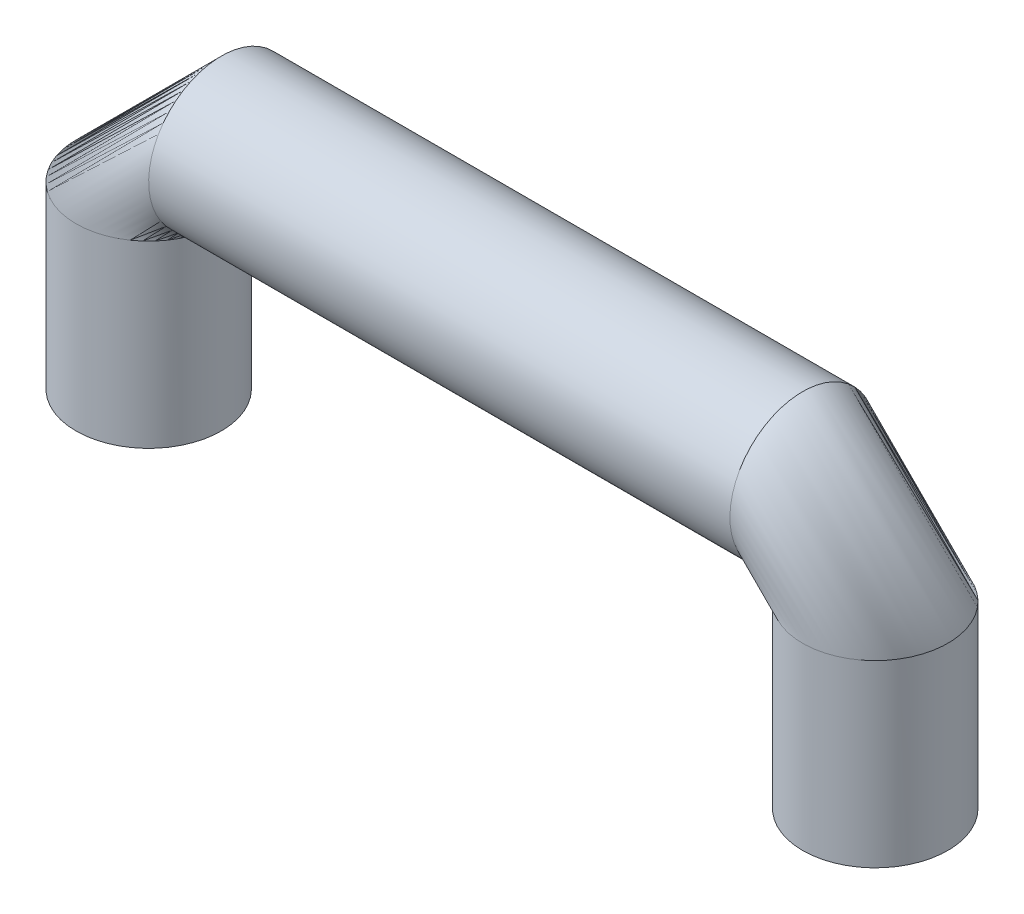
ISO-10303-21;
HEADER;
FILE_DESCRIPTION(('STEP AP214'),'2;1');
FILE_NAME('part.step','',(''),(''),'','','');
FILE_SCHEMA(('AUTOMOTIVE_DESIGN { 1 0 10303 214 1 1 1 1 }'));
ENDSEC;
DATA;
#1=APPLICATION_CONTEXT('core data for automotive mechanical design processes');
#2=APPLICATION_PROTOCOL_DEFINITION('international standard','automotive_design',2000,#1);
#3=PRODUCT_CONTEXT('',#1,'mechanical');
#4=PRODUCT('Part','Part','',(#3));
#5=PRODUCT_RELATED_PRODUCT_CATEGORY('part','',(#4));
#6=PRODUCT_DEFINITION_FORMATION('','',#4);
#7=PRODUCT_DEFINITION_CONTEXT('part definition',#1,'design');
#8=PRODUCT_DEFINITION('design','',#6,#7);
#9=PRODUCT_DEFINITION_SHAPE('','',#8);
#10=(LENGTH_UNIT() NAMED_UNIT(*) SI_UNIT(.MILLI.,.METRE.));
#11=(NAMED_UNIT(*) PLANE_ANGLE_UNIT() SI_UNIT($,.RADIAN.));
#12=(NAMED_UNIT(*) SI_UNIT($,.STERADIAN.) SOLID_ANGLE_UNIT());
#13=UNCERTAINTY_MEASURE_WITH_UNIT(LENGTH_MEASURE(1.E-05),#10,'distance_accuracy_value','');
#14=(GEOMETRIC_REPRESENTATION_CONTEXT(3) GLOBAL_UNCERTAINTY_ASSIGNED_CONTEXT((#13)) GLOBAL_UNIT_ASSIGNED_CONTEXT((#10,
#11,#12)) REPRESENTATION_CONTEXT('',''));
#15=CARTESIAN_POINT('',(0.,0.,0.));
#16=DIRECTION('',(0.,0.,1.));
#17=DIRECTION('',(1.,0.,0.));
#18=AXIS2_PLACEMENT_3D('',#15,#16,#17);
#19=CARTESIAN_POINT('',(0.,0.,0.));
#20=DIRECTION('',(0.,-1.,0.));
#21=DIRECTION('',(0.,0.,1.));
#22=AXIS2_PLACEMENT_3D('',#19,#20,#21);
#23=PLANE('',#22);
#24=CARTESIAN_POINT('',(0.,0.,0.));
#25=DIRECTION('',(0.,-1.,0.));
#26=DIRECTION('',(0.,0.,1.));
#27=AXIS2_PLACEMENT_3D('',#24,#25,#26);
#28=CIRCLE('',#27,25.4);
#29=CARTESIAN_POINT('',(0.,0.,25.4));
#30=VERTEX_POINT('',#29);
#31=EDGE_CURVE('E59',#30,#30,#28,.T.);
#32=ORIENTED_EDGE('',*,*,#31,.T.);
#33=EDGE_LOOP('',(#32));
#34=FACE_BOUND('',#33,.T.);
#35=ADVANCED_FACE('F47',(#34),#23,.T.);
#36=CARTESIAN_POINT('',(254.,0.,0.));
#37=DIRECTION('',(0.,1.,0.));
#38=DIRECTION('',(0.,0.,1.));
#39=AXIS2_PLACEMENT_3D('',#36,#37,#38);
#40=PLANE('',#39);
#41=CARTESIAN_POINT('',(254.,0.,0.));
#42=DIRECTION('',(0.,1.,0.));
#43=DIRECTION('',(0.,0.,1.));
#44=AXIS2_PLACEMENT_3D('',#41,#42,#43);
#45=CIRCLE('',#44,25.4);
#46=CARTESIAN_POINT('',(254.,0.,25.4));
#47=VERTEX_POINT('',#46);
#48=EDGE_CURVE('E12',#47,#47,#45,.T.);
#49=ORIENTED_EDGE('',*,*,#48,.F.);
#50=EDGE_LOOP('',(#49));
#51=FACE_BOUND('',#50,.T.);
#52=ADVANCED_FACE('F85',(#51),#40,.F.);
#53=CARTESIAN_POINT('',(0.,0.,0.));
#54=DIRECTION('',(0.,1.,0.));
#55=DIRECTION('',(0.,0.,1.));
#56=AXIS2_PLACEMENT_3D('',#53,#54,#55);
#57=CYLINDRICAL_SURFACE('',#56,25.4);
#58=CARTESIAN_POINT('',(0.,62.738,0.));
#59=DIRECTION('',(0.,-1.,0.));
#60=DIRECTION('',(0.,0.,1.));
#61=AXIS2_PLACEMENT_3D('',#58,#59,#60);
#62=CIRCLE('',#61,25.4);
#63=CARTESIAN_POINT('',(25.4,62.738,0.));
#64=VERTEX_POINT('',#63);
#65=EDGE_CURVE('E78',#64,#64,#62,.T.);
#66=ORIENTED_EDGE('',*,*,#65,.T.);
#67=EDGE_LOOP('',(#66));
#68=FACE_BOUND('',#67,.T.);
#69=ORIENTED_EDGE('',*,*,#31,.F.);
#70=EDGE_LOOP('',(#69));
#71=FACE_BOUND('',#70,.T.);
#72=ADVANCED_FACE('F89',(#68,#71),#57,.T.);
#73=CARTESIAN_POINT('',(25.4,62.738,0.));
#74=DIRECTION('',(0.,0.,-1.));
#75=DIRECTION('',(-1.,0.,0.));
#76=AXIS2_PLACEMENT_3D('',#73,#74,#75);
#77=TOROIDAL_SURFACE('',#76,25.4,25.4);
#78=CARTESIAN_POINT('',(25.4,88.138,0.));
#79=DIRECTION('',(-1.,0.,0.));
#80=DIRECTION('',(0.,0.,1.));
#81=AXIS2_PLACEMENT_3D('',#78,#79,#80);
#82=CIRCLE('',#81,25.4);
#83=EDGE_CURVE('E75',#64,#64,#82,.T.);
#84=ORIENTED_EDGE('',*,*,#83,.T.);
#85=ORIENTED_EDGE('',*,*,#65,.F.);
#86=EDGE_LOOP('',(#84,#85));
#87=FACE_BOUND('',#86,.T.);
#88=ADVANCED_FACE('F103',(#87),#77,.T.);
#89=CARTESIAN_POINT('',(25.4,88.138,0.));
#90=DIRECTION('',(1.,0.,0.));
#91=DIRECTION('',(0.,1.,0.));
#92=AXIS2_PLACEMENT_3D('',#89,#90,#91);
#93=CYLINDRICAL_SURFACE('',#92,25.4);
#94=CARTESIAN_POINT('',(228.6,88.138,0.));
#95=DIRECTION('',(-1.,0.,0.));
#96=DIRECTION('',(0.,0.,1.));
#97=AXIS2_PLACEMENT_3D('',#94,#95,#96);
#98=CIRCLE('',#97,25.4);
#99=CARTESIAN_POINT('',(228.6,62.738,0.));
#100=VERTEX_POINT('',#99);
#101=EDGE_CURVE('E71',#100,#100,#98,.T.);
#102=ORIENTED_EDGE('',*,*,#101,.T.);
#103=EDGE_LOOP('',(#102));
#104=FACE_BOUND('',#103,.T.);
#105=ORIENTED_EDGE('',*,*,#83,.F.);
#106=EDGE_LOOP('',(#105));
#107=FACE_BOUND('',#106,.T.);
#108=ADVANCED_FACE('F97',(#104,#107),#93,.T.);
#109=CARTESIAN_POINT('',(228.6,62.738,0.));
#110=DIRECTION('',(0.,0.,-1.));
#111=DIRECTION('',(-1.,0.,0.));
#112=AXIS2_PLACEMENT_3D('',#109,#110,#111);
#113=TOROIDAL_SURFACE('',#112,25.4,25.4);
#114=CARTESIAN_POINT('',(254.,62.738,0.));
#115=DIRECTION('',(0.,1.,0.));
#116=DIRECTION('',(0.,0.,1.));
#117=AXIS2_PLACEMENT_3D('',#114,#115,#116);
#118=CIRCLE('',#117,25.4);
#119=EDGE_CURVE('E54',#100,#100,#118,.T.);
#120=ORIENTED_EDGE('',*,*,#119,.T.);
#121=ORIENTED_EDGE('',*,*,#101,.F.);
#122=EDGE_LOOP('',(#120,#121));
#123=FACE_BOUND('',#122,.T.);
#124=ADVANCED_FACE('F72',(#123),#113,.T.);
#125=CARTESIAN_POINT('',(254.,62.738,0.));
#126=DIRECTION('',(0.,-1.,0.));
#127=DIRECTION('',(0.,0.,-1.));
#128=AXIS2_PLACEMENT_3D('',#125,#126,#127);
#129=CYLINDRICAL_SURFACE('',#128,25.4);
#130=ORIENTED_EDGE('',*,*,#48,.T.);
#131=EDGE_LOOP('',(#130));
#132=FACE_BOUND('',#131,.T.);
#133=ORIENTED_EDGE('',*,*,#119,.F.);
#134=EDGE_LOOP('',(#133));
#135=FACE_BOUND('',#134,.T.);
#136=ADVANCED_FACE('F91',(#132,#135),#129,.T.);
#137=CLOSED_SHELL('',(#35,#52,#72,#88,#108,#124,#136));
#138=MANIFOLD_SOLID_BREP('B2',#137);
#139=ADVANCED_BREP_SHAPE_REPRESENTATION('',(#18,#138),#14);
#140=SHAPE_DEFINITION_REPRESENTATION(#9,#139);
ENDSEC;
END-ISO-10303-21;
